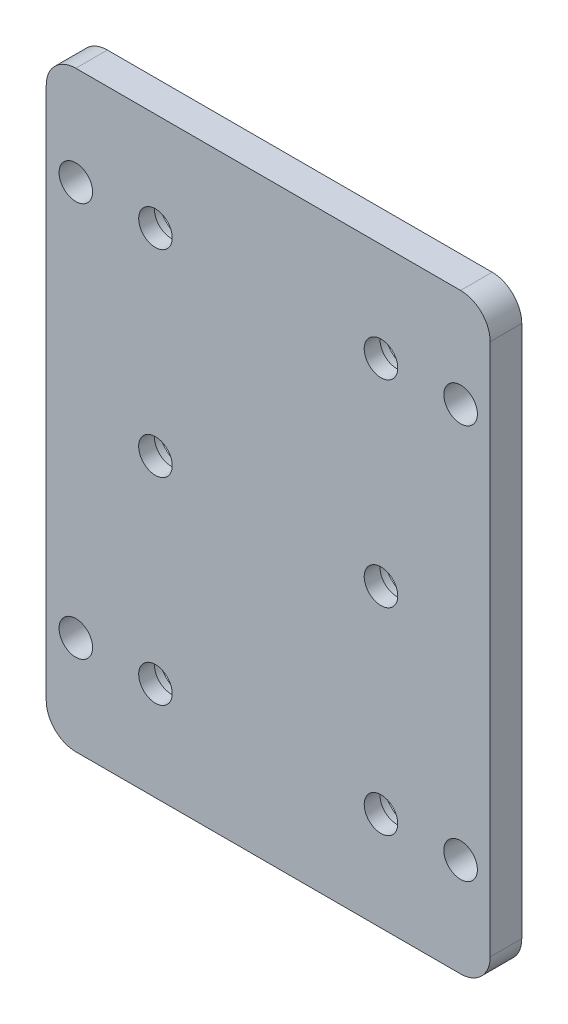
ISO-10303-21;
HEADER;
FILE_DESCRIPTION(('STEP AP214'),'2;1');
FILE_NAME('part.step','',(''),(''),'','','');
FILE_SCHEMA(('AUTOMOTIVE_DESIGN { 1 0 10303 214 1 1 1 1 }'));
ENDSEC;
DATA;
#1=APPLICATION_CONTEXT('core data for automotive mechanical design processes');
#2=APPLICATION_PROTOCOL_DEFINITION('international standard','automotive_design',2000,#1);
#3=PRODUCT_CONTEXT('',#1,'mechanical');
#4=PRODUCT('Part','Part','',(#3));
#5=PRODUCT_RELATED_PRODUCT_CATEGORY('part','',(#4));
#6=PRODUCT_DEFINITION_FORMATION('','',#4);
#7=PRODUCT_DEFINITION_CONTEXT('part definition',#1,'design');
#8=PRODUCT_DEFINITION('design','',#6,#7);
#9=PRODUCT_DEFINITION_SHAPE('','',#8);
#10=(LENGTH_UNIT() NAMED_UNIT(*) SI_UNIT(.MILLI.,.METRE.));
#11=(NAMED_UNIT(*) PLANE_ANGLE_UNIT() SI_UNIT($,.RADIAN.));
#12=(NAMED_UNIT(*) SI_UNIT($,.STERADIAN.) SOLID_ANGLE_UNIT());
#13=UNCERTAINTY_MEASURE_WITH_UNIT(LENGTH_MEASURE(1.E-05),#10,'distance_accuracy_value','');
#14=(GEOMETRIC_REPRESENTATION_CONTEXT(3) GLOBAL_UNCERTAINTY_ASSIGNED_CONTEXT((#13)) GLOBAL_UNIT_ASSIGNED_CONTEXT((#10,
#11,#12)) REPRESENTATION_CONTEXT('',''));
#15=CARTESIAN_POINT('',(0.,0.,0.));
#16=DIRECTION('',(0.,0.,1.));
#17=DIRECTION('',(1.,0.,0.));
#18=AXIS2_PLACEMENT_3D('',#15,#16,#17);
#19=CARTESIAN_POINT('',(-11.43,0.,0.));
#20=DIRECTION('',(0.,0.,1.));
#21=DIRECTION('',(1.,0.,0.));
#22=AXIS2_PLACEMENT_3D('',#19,#20,#21);
#23=CYLINDRICAL_SURFACE('',#22,1.7);
#24=CARTESIAN_POINT('',(-11.43,0.,3.2));
#25=DIRECTION('',(0.,0.,1.));
#26=DIRECTION('',(1.,0.,0.));
#27=AXIS2_PLACEMENT_3D('',#24,#25,#26);
#28=CIRCLE('',#27,1.7);
#29=CARTESIAN_POINT('',(-9.73,0.,3.2));
#30=VERTEX_POINT('',#29);
#31=EDGE_CURVE('E128',#30,#30,#28,.T.);
#32=ORIENTED_EDGE('',*,*,#31,.T.);
#33=EDGE_LOOP('',(#32));
#34=FACE_BOUND('',#33,.T.);
#35=CARTESIAN_POINT('',(-11.43,0.,1.6));
#36=DIRECTION('',(0.,0.,-1.));
#37=DIRECTION('',(-1.,0.,0.));
#38=AXIS2_PLACEMENT_3D('',#35,#36,#37);
#39=CIRCLE('',#38,1.7);
#40=CARTESIAN_POINT('',(-13.13,0.,1.6));
#41=VERTEX_POINT('',#40);
#42=EDGE_CURVE('E37',#41,#41,#39,.F.);
#43=ORIENTED_EDGE('',*,*,#42,.F.);
#44=EDGE_LOOP('',(#43));
#45=FACE_BOUND('',#44,.T.);
#46=ADVANCED_FACE('F33',(#34,#45),#23,.F.);
#47=CARTESIAN_POINT('',(11.43,0.,0.));
#48=DIRECTION('',(0.,0.,1.));
#49=DIRECTION('',(1.,0.,0.));
#50=AXIS2_PLACEMENT_3D('',#47,#48,#49);
#51=CYLINDRICAL_SURFACE('',#50,1.7);
#52=CARTESIAN_POINT('',(11.43,0.,3.2));
#53=DIRECTION('',(0.,0.,1.));
#54=DIRECTION('',(1.,0.,0.));
#55=AXIS2_PLACEMENT_3D('',#52,#53,#54);
#56=CIRCLE('',#55,1.7);
#57=CARTESIAN_POINT('',(13.13,0.,3.2));
#58=VERTEX_POINT('',#57);
#59=EDGE_CURVE('E134',#58,#58,#56,.T.);
#60=ORIENTED_EDGE('',*,*,#59,.T.);
#61=EDGE_LOOP('',(#60));
#62=FACE_BOUND('',#61,.T.);
#63=CARTESIAN_POINT('',(11.43,0.,1.6));
#64=DIRECTION('',(0.,0.,-1.));
#65=DIRECTION('',(-1.,0.,0.));
#66=AXIS2_PLACEMENT_3D('',#63,#64,#65);
#67=CIRCLE('',#66,1.7);
#68=CARTESIAN_POINT('',(9.73,0.,1.6));
#69=VERTEX_POINT('',#68);
#70=EDGE_CURVE('E178',#69,#69,#67,.F.);
#71=ORIENTED_EDGE('',*,*,#70,.F.);
#72=EDGE_LOOP('',(#71));
#73=FACE_BOUND('',#72,.T.);
#74=ADVANCED_FACE('F265',(#62,#73),#51,.F.);
#75=CARTESIAN_POINT('',(-11.4300000000001,20.,0.));
#76=DIRECTION('',(0.,0.,1.));
#77=DIRECTION('',(1.,0.,0.));
#78=AXIS2_PLACEMENT_3D('',#75,#76,#77);
#79=CYLINDRICAL_SURFACE('',#78,1.7);
#80=CARTESIAN_POINT('',(-11.4300000000001,20.,3.2));
#81=DIRECTION('',(0.,0.,1.));
#82=DIRECTION('',(1.,0.,0.));
#83=AXIS2_PLACEMENT_3D('',#80,#81,#82);
#84=CIRCLE('',#83,1.7);
#85=CARTESIAN_POINT('',(-9.73000000000007,20.,3.2));
#86=VERTEX_POINT('',#85);
#87=EDGE_CURVE('E221',#86,#86,#84,.T.);
#88=ORIENTED_EDGE('',*,*,#87,.T.);
#89=EDGE_LOOP('',(#88));
#90=FACE_BOUND('',#89,.T.);
#91=CARTESIAN_POINT('',(-11.4300000000001,20.,1.6));
#92=DIRECTION('',(0.,0.,-1.));
#93=DIRECTION('',(-1.,0.,0.));
#94=AXIS2_PLACEMENT_3D('',#91,#92,#93);
#95=CIRCLE('',#94,1.7);
#96=CARTESIAN_POINT('',(-13.1300000000001,20.,1.6));
#97=VERTEX_POINT('',#96);
#98=EDGE_CURVE('E176',#97,#97,#95,.F.);
#99=ORIENTED_EDGE('',*,*,#98,.F.);
#100=EDGE_LOOP('',(#99));
#101=FACE_BOUND('',#100,.T.);
#102=ADVANCED_FACE('F271',(#90,#101),#79,.F.);
#103=CARTESIAN_POINT('',(-11.4300000000001,-20.,0.));
#104=DIRECTION('',(0.,0.,1.));
#105=DIRECTION('',(1.,0.,0.));
#106=AXIS2_PLACEMENT_3D('',#103,#104,#105);
#107=CYLINDRICAL_SURFACE('',#106,1.7);
#108=CARTESIAN_POINT('',(-11.4300000000001,-20.,3.2));
#109=DIRECTION('',(0.,0.,1.));
#110=DIRECTION('',(-1.,0.,0.));
#111=AXIS2_PLACEMENT_3D('',#108,#109,#110);
#112=CIRCLE('',#111,1.7);
#113=CARTESIAN_POINT('',(-13.1300000000001,-20.,3.2));
#114=VERTEX_POINT('',#113);
#115=EDGE_CURVE('E222',#114,#114,#112,.T.);
#116=ORIENTED_EDGE('',*,*,#115,.T.);
#117=EDGE_LOOP('',(#116));
#118=FACE_BOUND('',#117,.T.);
#119=CARTESIAN_POINT('',(-11.4300000000001,-20.,1.6));
#120=DIRECTION('',(0.,0.,-1.));
#121=DIRECTION('',(-1.,0.,0.));
#122=AXIS2_PLACEMENT_3D('',#119,#120,#121);
#123=CIRCLE('',#122,1.7);
#124=CARTESIAN_POINT('',(-13.1300000000001,-20.,1.6));
#125=VERTEX_POINT('',#124);
#126=EDGE_CURVE('E172',#125,#125,#123,.F.);
#127=ORIENTED_EDGE('',*,*,#126,.F.);
#128=EDGE_LOOP('',(#127));
#129=FACE_BOUND('',#128,.T.);
#130=ADVANCED_FACE('F331',(#118,#129),#107,.F.);
#131=CARTESIAN_POINT('',(11.4299999999999,-20.,0.));
#132=DIRECTION('',(0.,0.,1.));
#133=DIRECTION('',(1.,0.,0.));
#134=AXIS2_PLACEMENT_3D('',#131,#132,#133);
#135=CYLINDRICAL_SURFACE('',#134,1.7);
#136=CARTESIAN_POINT('',(11.4299999999999,-20.,3.2));
#137=DIRECTION('',(0.,0.,1.));
#138=DIRECTION('',(-1.,0.,0.));
#139=AXIS2_PLACEMENT_3D('',#136,#137,#138);
#140=CIRCLE('',#139,1.7);
#141=CARTESIAN_POINT('',(9.7299999999999,-20.,3.2));
#142=VERTEX_POINT('',#141);
#143=EDGE_CURVE('E215',#142,#142,#140,.T.);
#144=ORIENTED_EDGE('',*,*,#143,.T.);
#145=EDGE_LOOP('',(#144));
#146=FACE_BOUND('',#145,.T.);
#147=CARTESIAN_POINT('',(11.4299999999999,-20.,1.6));
#148=DIRECTION('',(0.,0.,-1.));
#149=DIRECTION('',(-1.,0.,0.));
#150=AXIS2_PLACEMENT_3D('',#147,#148,#149);
#151=CIRCLE('',#150,1.7);
#152=CARTESIAN_POINT('',(9.7299999999999,-20.,1.6));
#153=VERTEX_POINT('',#152);
#154=EDGE_CURVE('E169',#153,#153,#151,.F.);
#155=ORIENTED_EDGE('',*,*,#154,.F.);
#156=EDGE_LOOP('',(#155));
#157=FACE_BOUND('',#156,.T.);
#158=ADVANCED_FACE('F340',(#146,#157),#135,.F.);
#159=CARTESIAN_POINT('',(11.4299999999999,20.,0.));
#160=DIRECTION('',(0.,0.,1.));
#161=DIRECTION('',(1.,0.,0.));
#162=AXIS2_PLACEMENT_3D('',#159,#160,#161);
#163=CYLINDRICAL_SURFACE('',#162,1.7);
#164=CARTESIAN_POINT('',(11.4299999999999,20.,3.2));
#165=DIRECTION('',(0.,0.,1.));
#166=DIRECTION('',(1.,0.,0.));
#167=AXIS2_PLACEMENT_3D('',#164,#165,#166);
#168=CIRCLE('',#167,1.7);
#169=CARTESIAN_POINT('',(13.1299999999999,20.,3.2));
#170=VERTEX_POINT('',#169);
#171=EDGE_CURVE('E218',#170,#170,#168,.T.);
#172=ORIENTED_EDGE('',*,*,#171,.T.);
#173=EDGE_LOOP('',(#172));
#174=FACE_BOUND('',#173,.T.);
#175=CARTESIAN_POINT('',(11.4299999999999,20.,1.6));
#176=DIRECTION('',(0.,0.,-1.));
#177=DIRECTION('',(-1.,0.,0.));
#178=AXIS2_PLACEMENT_3D('',#175,#176,#177);
#179=CIRCLE('',#178,1.7);
#180=CARTESIAN_POINT('',(9.72999999999993,20.,1.6));
#181=VERTEX_POINT('',#180);
#182=EDGE_CURVE('E164',#181,#181,#179,.F.);
#183=ORIENTED_EDGE('',*,*,#182,.F.);
#184=EDGE_LOOP('',(#183));
#185=FACE_BOUND('',#184,.T.);
#186=ADVANCED_FACE('F292',(#174,#185),#163,.F.);
#187=CARTESIAN_POINT('',(-22.5,30.,3.2));
#188=DIRECTION('',(1.,0.,0.));
#189=DIRECTION('',(0.,0.,-1.));
#190=AXIS2_PLACEMENT_3D('',#187,#188,#189);
#191=PLANE('',#190);
#192=DIRECTION('',(0.,-1.,0.));
#193=VECTOR('',#192,1.);
#194=CARTESIAN_POINT('',(-22.5,30.,3.2));
#195=LINE('',#194,#193);
#196=CARTESIAN_POINT('',(-22.5,27.,3.2));
#197=VERTEX_POINT('',#196);
#198=CARTESIAN_POINT('',(-22.5,-27.,3.2));
#199=VERTEX_POINT('',#198);
#200=EDGE_CURVE('E121',#197,#199,#195,.T.);
#201=ORIENTED_EDGE('',*,*,#200,.F.);
#202=DIRECTION('',(0.,0.,-1.));
#203=VECTOR('',#202,1.);
#204=CARTESIAN_POINT('',(-22.5,27.,3.2));
#205=LINE('',#204,#203);
#206=CARTESIAN_POINT('',(-22.5,27.,0.));
#207=VERTEX_POINT('',#206);
#208=EDGE_CURVE('E105',#197,#207,#205,.T.);
#209=ORIENTED_EDGE('',*,*,#208,.T.);
#210=DIRECTION('',(0.,-1.,0.));
#211=VECTOR('',#210,1.);
#212=CARTESIAN_POINT('',(-22.5,30.,0.));
#213=LINE('',#212,#211);
#214=CARTESIAN_POINT('',(-22.5,-27.,0.));
#215=VERTEX_POINT('',#214);
#216=EDGE_CURVE('E118',#207,#215,#213,.T.);
#217=ORIENTED_EDGE('',*,*,#216,.T.);
#218=DIRECTION('',(0.,0.,-1.));
#219=VECTOR('',#218,1.);
#220=CARTESIAN_POINT('',(-22.5,-27.,3.2));
#221=LINE('',#220,#219);
#222=EDGE_CURVE('E123',#215,#199,#221,.F.);
#223=ORIENTED_EDGE('',*,*,#222,.T.);
#224=EDGE_LOOP('',(#201,#209,#217,#223));
#225=FACE_BOUND('',#224,.T.);
#226=ADVANCED_FACE('F117',(#225),#191,.F.);
#227=CARTESIAN_POINT('',(-22.5,-30.,3.2));
#228=DIRECTION('',(0.,1.,0.));
#229=DIRECTION('',(0.,0.,1.));
#230=AXIS2_PLACEMENT_3D('',#227,#228,#229);
#231=PLANE('',#230);
#232=DIRECTION('',(1.,0.,0.));
#233=VECTOR('',#232,1.);
#234=CARTESIAN_POINT('',(-22.5,-30.,0.));
#235=LINE('',#234,#233);
#236=CARTESIAN_POINT('',(-19.5,-30.,0.));
#237=VERTEX_POINT('',#236);
#238=CARTESIAN_POINT('',(19.5,-30.,0.));
#239=VERTEX_POINT('',#238);
#240=EDGE_CURVE('E127',#237,#239,#235,.T.);
#241=ORIENTED_EDGE('',*,*,#240,.T.);
#242=DIRECTION('',(0.,0.,-1.));
#243=VECTOR('',#242,1.);
#244=CARTESIAN_POINT('',(19.5,-30.,3.2));
#245=LINE('',#244,#243);
#246=CARTESIAN_POINT('',(19.5,-30.,3.2));
#247=VERTEX_POINT('',#246);
#248=EDGE_CURVE('E11',#239,#247,#245,.F.);
#249=ORIENTED_EDGE('',*,*,#248,.T.);
#250=DIRECTION('',(1.,0.,0.));
#251=VECTOR('',#250,1.);
#252=CARTESIAN_POINT('',(-22.5,-30.,3.2));
#253=LINE('',#252,#251);
#254=CARTESIAN_POINT('',(-19.5,-30.,3.2));
#255=VERTEX_POINT('',#254);
#256=EDGE_CURVE('E232',#255,#247,#253,.T.);
#257=ORIENTED_EDGE('',*,*,#256,.F.);
#258=DIRECTION('',(0.,0.,-1.));
#259=VECTOR('',#258,1.);
#260=CARTESIAN_POINT('',(-19.5,-30.,3.2));
#261=LINE('',#260,#259);
#262=EDGE_CURVE('E42',#255,#237,#261,.T.);
#263=ORIENTED_EDGE('',*,*,#262,.T.);
#264=EDGE_LOOP('',(#241,#249,#257,#263));
#265=FACE_BOUND('',#264,.T.);
#266=ADVANCED_FACE('F250',(#265),#231,.F.);
#267=CARTESIAN_POINT('',(22.5,30.,3.2));
#268=DIRECTION('',(-1.,0.,0.));
#269=DIRECTION('',(0.,-1.,0.));
#270=AXIS2_PLACEMENT_3D('',#267,#268,#269);
#271=PLANE('',#270);
#272=DIRECTION('',(0.,1.,0.));
#273=VECTOR('',#272,1.);
#274=CARTESIAN_POINT('',(22.5,30.,0.));
#275=LINE('',#274,#273);
#276=CARTESIAN_POINT('',(22.5,-27.,0.));
#277=VERTEX_POINT('',#276);
#278=CARTESIAN_POINT('',(22.5,27.,0.));
#279=VERTEX_POINT('',#278);
#280=EDGE_CURVE('E131',#277,#279,#275,.T.);
#281=ORIENTED_EDGE('',*,*,#280,.T.);
#282=DIRECTION('',(0.,0.,-1.));
#283=VECTOR('',#282,1.);
#284=CARTESIAN_POINT('',(22.5,27.,3.2));
#285=LINE('',#284,#283);
#286=CARTESIAN_POINT('',(22.5,27.,3.2));
#287=VERTEX_POINT('',#286);
#288=EDGE_CURVE('E50',#279,#287,#285,.F.);
#289=ORIENTED_EDGE('',*,*,#288,.T.);
#290=DIRECTION('',(0.,1.,0.));
#291=VECTOR('',#290,1.);
#292=CARTESIAN_POINT('',(22.5,30.,3.2));
#293=LINE('',#292,#291);
#294=CARTESIAN_POINT('',(22.5,-27.,3.2));
#295=VERTEX_POINT('',#294);
#296=EDGE_CURVE('E233',#295,#287,#293,.T.);
#297=ORIENTED_EDGE('',*,*,#296,.F.);
#298=DIRECTION('',(0.,0.,-1.));
#299=VECTOR('',#298,1.);
#300=CARTESIAN_POINT('',(22.5,-27.,3.2));
#301=LINE('',#300,#299);
#302=EDGE_CURVE('E158',#295,#277,#301,.T.);
#303=ORIENTED_EDGE('',*,*,#302,.T.);
#304=EDGE_LOOP('',(#281,#289,#297,#303));
#305=FACE_BOUND('',#304,.T.);
#306=ADVANCED_FACE('F244',(#305),#271,.F.);
#307=CARTESIAN_POINT('',(-22.5,30.,3.2));
#308=DIRECTION('',(0.,-1.,0.));
#309=DIRECTION('',(0.,0.,-1.));
#310=AXIS2_PLACEMENT_3D('',#307,#308,#309);
#311=PLANE('',#310);
#312=DIRECTION('',(-1.,0.,0.));
#313=VECTOR('',#312,1.);
#314=CARTESIAN_POINT('',(-22.5,30.,0.));
#315=LINE('',#314,#313);
#316=CARTESIAN_POINT('',(19.5,30.,0.));
#317=VERTEX_POINT('',#316);
#318=CARTESIAN_POINT('',(-19.5,30.,0.));
#319=VERTEX_POINT('',#318);
#320=EDGE_CURVE('E141',#317,#319,#315,.T.);
#321=ORIENTED_EDGE('',*,*,#320,.T.);
#322=DIRECTION('',(0.,0.,-1.));
#323=VECTOR('',#322,1.);
#324=CARTESIAN_POINT('',(-19.5,30.,3.2));
#325=LINE('',#324,#323);
#326=CARTESIAN_POINT('',(-19.5,30.,3.2));
#327=VERTEX_POINT('',#326);
#328=EDGE_CURVE('E106',#319,#327,#325,.F.);
#329=ORIENTED_EDGE('',*,*,#328,.T.);
#330=DIRECTION('',(-1.,0.,0.));
#331=VECTOR('',#330,1.);
#332=CARTESIAN_POINT('',(-22.5,30.,3.2));
#333=LINE('',#332,#331);
#334=CARTESIAN_POINT('',(19.5,30.,3.2));
#335=VERTEX_POINT('',#334);
#336=EDGE_CURVE('E137',#335,#327,#333,.T.);
#337=ORIENTED_EDGE('',*,*,#336,.F.);
#338=DIRECTION('',(0.,0.,-1.));
#339=VECTOR('',#338,1.);
#340=CARTESIAN_POINT('',(19.5,30.,3.2));
#341=LINE('',#340,#339);
#342=EDGE_CURVE('E111',#335,#317,#341,.T.);
#343=ORIENTED_EDGE('',*,*,#342,.T.);
#344=EDGE_LOOP('',(#321,#329,#337,#343));
#345=FACE_BOUND('',#344,.T.);
#346=ADVANCED_FACE('F240',(#345),#311,.F.);
#347=CARTESIAN_POINT('',(0.,0.,3.2));
#348=DIRECTION('',(0.,0.,1.));
#349=DIRECTION('',(1.,0.,0.));
#350=AXIS2_PLACEMENT_3D('',#347,#348,#349);
#351=PLANE('',#350);
#352=CARTESIAN_POINT('',(19.5,20.,3.2));
#353=DIRECTION('',(0.,0.,1.));
#354=DIRECTION('',(1.,0.,0.));
#355=AXIS2_PLACEMENT_3D('',#352,#353,#354);
#356=CIRCLE('',#355,1.7);
#357=CARTESIAN_POINT('',(21.2,20.,3.2));
#358=VERTEX_POINT('',#357);
#359=EDGE_CURVE('E198',#358,#358,#356,.T.);
#360=ORIENTED_EDGE('',*,*,#359,.F.);
#361=EDGE_LOOP('',(#360));
#362=FACE_BOUND('',#361,.T.);
#363=CARTESIAN_POINT('',(19.5,-20.,3.2));
#364=DIRECTION('',(0.,0.,1.));
#365=DIRECTION('',(-1.,0.,0.));
#366=AXIS2_PLACEMENT_3D('',#363,#364,#365);
#367=CIRCLE('',#366,1.7);
#368=CARTESIAN_POINT('',(17.8,-20.,3.2));
#369=VERTEX_POINT('',#368);
#370=EDGE_CURVE('E204',#369,#369,#367,.T.);
#371=ORIENTED_EDGE('',*,*,#370,.F.);
#372=EDGE_LOOP('',(#371));
#373=FACE_BOUND('',#372,.T.);
#374=CARTESIAN_POINT('',(-19.5,-20.,3.2));
#375=DIRECTION('',(0.,0.,1.));
#376=DIRECTION('',(-1.,0.,0.));
#377=AXIS2_PLACEMENT_3D('',#374,#375,#376);
#378=CIRCLE('',#377,1.7);
#379=CARTESIAN_POINT('',(-21.2,-20.,3.2));
#380=VERTEX_POINT('',#379);
#381=EDGE_CURVE('E167',#380,#380,#378,.T.);
#382=ORIENTED_EDGE('',*,*,#381,.F.);
#383=EDGE_LOOP('',(#382));
#384=FACE_BOUND('',#383,.T.);
#385=CARTESIAN_POINT('',(-19.5,20.,3.2));
#386=DIRECTION('',(0.,0.,1.));
#387=DIRECTION('',(1.,0.,0.));
#388=AXIS2_PLACEMENT_3D('',#385,#386,#387);
#389=CIRCLE('',#388,1.7);
#390=CARTESIAN_POINT('',(-17.8,20.,3.2));
#391=VERTEX_POINT('',#390);
#392=EDGE_CURVE('E197',#391,#391,#389,.T.);
#393=ORIENTED_EDGE('',*,*,#392,.F.);
#394=EDGE_LOOP('',(#393));
#395=FACE_BOUND('',#394,.T.);
#396=ORIENTED_EDGE('',*,*,#143,.F.);
#397=EDGE_LOOP('',(#396));
#398=FACE_BOUND('',#397,.T.);
#399=ORIENTED_EDGE('',*,*,#115,.F.);
#400=EDGE_LOOP('',(#399));
#401=FACE_BOUND('',#400,.T.);
#402=ORIENTED_EDGE('',*,*,#171,.F.);
#403=EDGE_LOOP('',(#402));
#404=FACE_BOUND('',#403,.T.);
#405=ORIENTED_EDGE('',*,*,#87,.F.);
#406=EDGE_LOOP('',(#405));
#407=FACE_BOUND('',#406,.T.);
#408=ORIENTED_EDGE('',*,*,#59,.F.);
#409=EDGE_LOOP('',(#408));
#410=FACE_BOUND('',#409,.T.);
#411=ORIENTED_EDGE('',*,*,#31,.F.);
#412=EDGE_LOOP('',(#411));
#413=FACE_BOUND('',#412,.T.);
#414=ORIENTED_EDGE('',*,*,#336,.T.);
#415=CARTESIAN_POINT('',(-19.5,27.,3.2));
#416=DIRECTION('',(0.,0.,1.));
#417=DIRECTION('',(1.,0.,0.));
#418=AXIS2_PLACEMENT_3D('',#415,#416,#417);
#419=CIRCLE('',#418,3.);
#420=EDGE_CURVE('E156',#327,#197,#419,.T.);
#421=ORIENTED_EDGE('',*,*,#420,.T.);
#422=ORIENTED_EDGE('',*,*,#200,.T.);
#423=CARTESIAN_POINT('',(-19.5,-27.,3.2));
#424=DIRECTION('',(0.,0.,1.));
#425=DIRECTION('',(1.,0.,0.));
#426=AXIS2_PLACEMENT_3D('',#423,#424,#425);
#427=CIRCLE('',#426,3.);
#428=EDGE_CURVE('E151',#199,#255,#427,.T.);
#429=ORIENTED_EDGE('',*,*,#428,.T.);
#430=ORIENTED_EDGE('',*,*,#256,.T.);
#431=CARTESIAN_POINT('',(19.5,-27.,3.2));
#432=DIRECTION('',(0.,0.,1.));
#433=DIRECTION('',(1.,0.,0.));
#434=AXIS2_PLACEMENT_3D('',#431,#432,#433);
#435=CIRCLE('',#434,3.);
#436=EDGE_CURVE('E57',#247,#295,#435,.T.);
#437=ORIENTED_EDGE('',*,*,#436,.T.);
#438=ORIENTED_EDGE('',*,*,#296,.T.);
#439=CARTESIAN_POINT('',(19.5,27.,3.2));
#440=DIRECTION('',(0.,0.,1.));
#441=DIRECTION('',(1.,0.,0.));
#442=AXIS2_PLACEMENT_3D('',#439,#440,#441);
#443=CIRCLE('',#442,3.);
#444=EDGE_CURVE('E154',#287,#335,#443,.T.);
#445=ORIENTED_EDGE('',*,*,#444,.T.);
#446=EDGE_LOOP('',(#414,#421,#422,#429,#430,#437,#438,#445));
#447=FACE_BOUND('',#446,.T.);
#448=ADVANCED_FACE('F237',(#362,#373,#384,#395,#398,#401,#404,#407,#410,#413,#447),#351,.T.);
#449=CARTESIAN_POINT('',(0.,0.,0.));
#450=DIRECTION('',(0.,0.,1.));
#451=DIRECTION('',(1.,0.,0.));
#452=AXIS2_PLACEMENT_3D('',#449,#450,#451);
#453=PLANE('',#452);
#454=CARTESIAN_POINT('',(-11.4300000000001,-20.,0.));
#455=DIRECTION('',(0.,0.,-1.));
#456=DIRECTION('',(-1.,0.,0.));
#457=AXIS2_PLACEMENT_3D('',#454,#455,#456);
#458=CIRCLE('',#457,3.);
#459=CARTESIAN_POINT('',(-14.4300000000001,-20.,0.));
#460=VERTEX_POINT('',#459);
#461=EDGE_CURVE('E620',#460,#460,#458,.T.);
#462=ORIENTED_EDGE('',*,*,#461,.F.);
#463=EDGE_LOOP('',(#462));
#464=FACE_BOUND('',#463,.T.);
#465=CARTESIAN_POINT('',(11.4299999999999,-20.,0.));
#466=DIRECTION('',(0.,0.,-1.));
#467=DIRECTION('',(-1.,0.,0.));
#468=AXIS2_PLACEMENT_3D('',#465,#466,#467);
#469=CIRCLE('',#468,3.);
#470=CARTESIAN_POINT('',(8.4299999999999,-20.,0.));
#471=VERTEX_POINT('',#470);
#472=EDGE_CURVE('E612',#471,#471,#469,.T.);
#473=ORIENTED_EDGE('',*,*,#472,.F.);
#474=EDGE_LOOP('',(#473));
#475=FACE_BOUND('',#474,.T.);
#476=CARTESIAN_POINT('',(-11.43,0.,0.));
#477=DIRECTION('',(0.,0.,-1.));
#478=DIRECTION('',(-1.,0.,0.));
#479=AXIS2_PLACEMENT_3D('',#476,#477,#478);
#480=CIRCLE('',#479,3.);
#481=CARTESIAN_POINT('',(-14.43,0.,0.));
#482=VERTEX_POINT('',#481);
#483=EDGE_CURVE('E605',#482,#482,#480,.T.);
#484=ORIENTED_EDGE('',*,*,#483,.F.);
#485=EDGE_LOOP('',(#484));
#486=FACE_BOUND('',#485,.T.);
#487=CARTESIAN_POINT('',(11.43,0.,0.));
#488=DIRECTION('',(0.,0.,-1.));
#489=DIRECTION('',(-1.,0.,0.));
#490=AXIS2_PLACEMENT_3D('',#487,#488,#489);
#491=CIRCLE('',#490,3.);
#492=CARTESIAN_POINT('',(8.43,0.,0.));
#493=VERTEX_POINT('',#492);
#494=EDGE_CURVE('E609',#493,#493,#491,.T.);
#495=ORIENTED_EDGE('',*,*,#494,.F.);
#496=EDGE_LOOP('',(#495));
#497=FACE_BOUND('',#496,.T.);
#498=CARTESIAN_POINT('',(-11.4300000000001,20.,0.));
#499=DIRECTION('',(0.,0.,-1.));
#500=DIRECTION('',(-1.,0.,0.));
#501=AXIS2_PLACEMENT_3D('',#498,#499,#500);
#502=CIRCLE('',#501,3.);
#503=CARTESIAN_POINT('',(-14.4300000000001,20.,0.));
#504=VERTEX_POINT('',#503);
#505=EDGE_CURVE('E625',#504,#504,#502,.T.);
#506=ORIENTED_EDGE('',*,*,#505,.F.);
#507=EDGE_LOOP('',(#506));
#508=FACE_BOUND('',#507,.T.);
#509=CARTESIAN_POINT('',(11.4299999999999,20.,0.));
#510=DIRECTION('',(0.,0.,-1.));
#511=DIRECTION('',(-1.,0.,0.));
#512=AXIS2_PLACEMENT_3D('',#509,#510,#511);
#513=CIRCLE('',#512,3.);
#514=CARTESIAN_POINT('',(8.42999999999993,20.,0.));
#515=VERTEX_POINT('',#514);
#516=EDGE_CURVE('E183',#515,#515,#513,.T.);
#517=ORIENTED_EDGE('',*,*,#516,.F.);
#518=EDGE_LOOP('',(#517));
#519=FACE_BOUND('',#518,.T.);
#520=CARTESIAN_POINT('',(19.5,20.,0.));
#521=DIRECTION('',(0.,0.,1.));
#522=DIRECTION('',(1.,0.,0.));
#523=AXIS2_PLACEMENT_3D('',#520,#521,#522);
#524=CIRCLE('',#523,1.7);
#525=CARTESIAN_POINT('',(21.2,20.,0.));
#526=VERTEX_POINT('',#525);
#527=EDGE_CURVE('E194',#526,#526,#524,.T.);
#528=ORIENTED_EDGE('',*,*,#527,.T.);
#529=EDGE_LOOP('',(#528));
#530=FACE_BOUND('',#529,.T.);
#531=CARTESIAN_POINT('',(19.5,-20.,0.));
#532=DIRECTION('',(0.,0.,1.));
#533=DIRECTION('',(-1.,0.,0.));
#534=AXIS2_PLACEMENT_3D('',#531,#532,#533);
#535=CIRCLE('',#534,1.7);
#536=CARTESIAN_POINT('',(17.8,-20.,0.));
#537=VERTEX_POINT('',#536);
#538=EDGE_CURVE('E201',#537,#537,#535,.T.);
#539=ORIENTED_EDGE('',*,*,#538,.T.);
#540=EDGE_LOOP('',(#539));
#541=FACE_BOUND('',#540,.T.);
#542=CARTESIAN_POINT('',(-19.5,-20.,0.));
#543=DIRECTION('',(0.,0.,1.));
#544=DIRECTION('',(-1.,0.,0.));
#545=AXIS2_PLACEMENT_3D('',#542,#543,#544);
#546=CIRCLE('',#545,1.7);
#547=CARTESIAN_POINT('',(-21.2,-20.,0.));
#548=VERTEX_POINT('',#547);
#549=EDGE_CURVE('E207',#548,#548,#546,.T.);
#550=ORIENTED_EDGE('',*,*,#549,.T.);
#551=EDGE_LOOP('',(#550));
#552=FACE_BOUND('',#551,.T.);
#553=CARTESIAN_POINT('',(-19.5,20.,0.));
#554=DIRECTION('',(0.,0.,1.));
#555=DIRECTION('',(1.,0.,0.));
#556=AXIS2_PLACEMENT_3D('',#553,#554,#555);
#557=CIRCLE('',#556,1.7);
#558=CARTESIAN_POINT('',(-17.8,20.,0.));
#559=VERTEX_POINT('',#558);
#560=EDGE_CURVE('E212',#559,#559,#557,.T.);
#561=ORIENTED_EDGE('',*,*,#560,.T.);
#562=EDGE_LOOP('',(#561));
#563=FACE_BOUND('',#562,.T.);
#564=ORIENTED_EDGE('',*,*,#216,.F.);
#565=CARTESIAN_POINT('',(-19.5,27.,0.));
#566=DIRECTION('',(0.,0.,1.));
#567=DIRECTION('',(1.,0.,0.));
#568=AXIS2_PLACEMENT_3D('',#565,#566,#567);
#569=CIRCLE('',#568,3.);
#570=EDGE_CURVE('E101',#207,#319,#569,.F.);
#571=ORIENTED_EDGE('',*,*,#570,.T.);
#572=ORIENTED_EDGE('',*,*,#320,.F.);
#573=CARTESIAN_POINT('',(19.5,27.,0.));
#574=DIRECTION('',(0.,0.,1.));
#575=DIRECTION('',(1.,0.,0.));
#576=AXIS2_PLACEMENT_3D('',#573,#574,#575);
#577=CIRCLE('',#576,3.);
#578=EDGE_CURVE('E112',#317,#279,#577,.F.);
#579=ORIENTED_EDGE('',*,*,#578,.T.);
#580=ORIENTED_EDGE('',*,*,#280,.F.);
#581=CARTESIAN_POINT('',(19.5,-27.,0.));
#582=DIRECTION('',(0.,0.,1.));
#583=DIRECTION('',(1.,0.,0.));
#584=AXIS2_PLACEMENT_3D('',#581,#582,#583);
#585=CIRCLE('',#584,3.);
#586=EDGE_CURVE('E145',#277,#239,#585,.F.);
#587=ORIENTED_EDGE('',*,*,#586,.T.);
#588=ORIENTED_EDGE('',*,*,#240,.F.);
#589=CARTESIAN_POINT('',(-19.5,-27.,0.));
#590=DIRECTION('',(0.,0.,1.));
#591=DIRECTION('',(1.,0.,0.));
#592=AXIS2_PLACEMENT_3D('',#589,#590,#591);
#593=CIRCLE('',#592,3.);
#594=EDGE_CURVE('E122',#237,#215,#593,.F.);
#595=ORIENTED_EDGE('',*,*,#594,.T.);
#596=EDGE_LOOP('',(#564,#571,#572,#579,#580,#587,#588,#595));
#597=FACE_BOUND('',#596,.T.);
#598=ADVANCED_FACE('F125',(#464,#475,#486,#497,#508,#519,#530,#541,#552,#563,#597),#453,.F.);
#599=CARTESIAN_POINT('',(-19.5,20.,0.));
#600=DIRECTION('',(0.,0.,1.));
#601=DIRECTION('',(1.,0.,0.));
#602=AXIS2_PLACEMENT_3D('',#599,#600,#601);
#603=CYLINDRICAL_SURFACE('',#602,1.7);
#604=ORIENTED_EDGE('',*,*,#560,.F.);
#605=EDGE_LOOP('',(#604));
#606=FACE_BOUND('',#605,.T.);
#607=ORIENTED_EDGE('',*,*,#392,.T.);
#608=EDGE_LOOP('',(#607));
#609=FACE_BOUND('',#608,.T.);
#610=ADVANCED_FACE('F282',(#606,#609),#603,.F.);
#611=CARTESIAN_POINT('',(-19.5,-20.,0.));
#612=DIRECTION('',(0.,0.,1.));
#613=DIRECTION('',(1.,0.,0.));
#614=AXIS2_PLACEMENT_3D('',#611,#612,#613);
#615=CYLINDRICAL_SURFACE('',#614,1.7);
#616=ORIENTED_EDGE('',*,*,#549,.F.);
#617=EDGE_LOOP('',(#616));
#618=FACE_BOUND('',#617,.T.);
#619=ORIENTED_EDGE('',*,*,#381,.T.);
#620=EDGE_LOOP('',(#619));
#621=FACE_BOUND('',#620,.T.);
#622=ADVANCED_FACE('F493',(#618,#621),#615,.F.);
#623=CARTESIAN_POINT('',(19.5,-20.,0.));
#624=DIRECTION('',(0.,0.,1.));
#625=DIRECTION('',(1.,0.,0.));
#626=AXIS2_PLACEMENT_3D('',#623,#624,#625);
#627=CYLINDRICAL_SURFACE('',#626,1.7);
#628=ORIENTED_EDGE('',*,*,#538,.F.);
#629=EDGE_LOOP('',(#628));
#630=FACE_BOUND('',#629,.T.);
#631=ORIENTED_EDGE('',*,*,#370,.T.);
#632=EDGE_LOOP('',(#631));
#633=FACE_BOUND('',#632,.T.);
#634=ADVANCED_FACE('F489',(#630,#633),#627,.F.);
#635=CARTESIAN_POINT('',(19.5,20.,0.));
#636=DIRECTION('',(0.,0.,1.));
#637=DIRECTION('',(1.,0.,0.));
#638=AXIS2_PLACEMENT_3D('',#635,#636,#637);
#639=CYLINDRICAL_SURFACE('',#638,1.7);
#640=ORIENTED_EDGE('',*,*,#527,.F.);
#641=EDGE_LOOP('',(#640));
#642=FACE_BOUND('',#641,.T.);
#643=ORIENTED_EDGE('',*,*,#359,.T.);
#644=EDGE_LOOP('',(#643));
#645=FACE_BOUND('',#644,.T.);
#646=ADVANCED_FACE('F295',(#642,#645),#639,.F.);
#647=CARTESIAN_POINT('',(-19.5,27.,3.2));
#648=DIRECTION('',(0.,0.,-1.));
#649=DIRECTION('',(-1.,0.,0.));
#650=AXIS2_PLACEMENT_3D('',#647,#648,#649);
#651=CYLINDRICAL_SURFACE('',#650,3.);
#652=ORIENTED_EDGE('',*,*,#420,.F.);
#653=ORIENTED_EDGE('',*,*,#328,.F.);
#654=ORIENTED_EDGE('',*,*,#570,.F.);
#655=ORIENTED_EDGE('',*,*,#208,.F.);
#656=EDGE_LOOP('',(#652,#653,#654,#655));
#657=FACE_BOUND('',#656,.T.);
#658=ADVANCED_FACE('F104',(#657),#651,.T.);
#659=CARTESIAN_POINT('',(19.5,27.,3.2));
#660=DIRECTION('',(0.,0.,-1.));
#661=DIRECTION('',(-1.,0.,0.));
#662=AXIS2_PLACEMENT_3D('',#659,#660,#661);
#663=CYLINDRICAL_SURFACE('',#662,3.);
#664=ORIENTED_EDGE('',*,*,#444,.F.);
#665=ORIENTED_EDGE('',*,*,#288,.F.);
#666=ORIENTED_EDGE('',*,*,#578,.F.);
#667=ORIENTED_EDGE('',*,*,#342,.F.);
#668=EDGE_LOOP('',(#664,#665,#666,#667));
#669=FACE_BOUND('',#668,.T.);
#670=ADVANCED_FACE('F242',(#669),#663,.T.);
#671=CARTESIAN_POINT('',(19.5,-27.,3.2));
#672=DIRECTION('',(0.,0.,-1.));
#673=DIRECTION('',(-1.,0.,0.));
#674=AXIS2_PLACEMENT_3D('',#671,#672,#673);
#675=CYLINDRICAL_SURFACE('',#674,3.);
#676=ORIENTED_EDGE('',*,*,#436,.F.);
#677=ORIENTED_EDGE('',*,*,#248,.F.);
#678=ORIENTED_EDGE('',*,*,#586,.F.);
#679=ORIENTED_EDGE('',*,*,#302,.F.);
#680=EDGE_LOOP('',(#676,#677,#678,#679));
#681=FACE_BOUND('',#680,.T.);
#682=ADVANCED_FACE('F247',(#681),#675,.T.);
#683=CARTESIAN_POINT('',(-19.5,-27.,3.2));
#684=DIRECTION('',(0.,0.,-1.));
#685=DIRECTION('',(-1.,0.,0.));
#686=AXIS2_PLACEMENT_3D('',#683,#684,#685);
#687=CYLINDRICAL_SURFACE('',#686,3.);
#688=ORIENTED_EDGE('',*,*,#428,.F.);
#689=ORIENTED_EDGE('',*,*,#222,.F.);
#690=ORIENTED_EDGE('',*,*,#594,.F.);
#691=ORIENTED_EDGE('',*,*,#262,.F.);
#692=EDGE_LOOP('',(#688,#689,#690,#691));
#693=FACE_BOUND('',#692,.T.);
#694=ADVANCED_FACE('F35',(#693),#687,.T.);
#695=CARTESIAN_POINT('',(11.4299999999999,20.,1.6));
#696=DIRECTION('',(0.,0.,-1.));
#697=DIRECTION('',(-1.,0.,0.));
#698=AXIS2_PLACEMENT_3D('',#695,#696,#697);
#699=PLANE('',#698);
#700=CARTESIAN_POINT('',(11.4299999999999,20.,1.6));
#701=DIRECTION('',(0.,0.,-1.));
#702=DIRECTION('',(-1.,0.,0.));
#703=AXIS2_PLACEMENT_3D('',#700,#701,#702);
#704=CIRCLE('',#703,3.);
#705=CARTESIAN_POINT('',(8.42999999999993,20.,1.6));
#706=VERTEX_POINT('',#705);
#707=EDGE_CURVE('E168',#706,#706,#704,.T.);
#708=ORIENTED_EDGE('',*,*,#707,.T.);
#709=EDGE_LOOP('',(#708));
#710=FACE_BOUND('',#709,.T.);
#711=ORIENTED_EDGE('',*,*,#182,.T.);
#712=EDGE_LOOP('',(#711));
#713=FACE_BOUND('',#712,.T.);
#714=ADVANCED_FACE('F256',(#710,#713),#699,.T.);
#715=CARTESIAN_POINT('',(11.4299999999999,20.,1.6));
#716=DIRECTION('',(0.,0.,-1.));
#717=DIRECTION('',(-1.,0.,0.));
#718=AXIS2_PLACEMENT_3D('',#715,#716,#717);
#719=CYLINDRICAL_SURFACE('',#718,3.);
#720=ORIENTED_EDGE('',*,*,#707,.F.);
#721=EDGE_LOOP('',(#720));
#722=FACE_BOUND('',#721,.T.);
#723=ORIENTED_EDGE('',*,*,#516,.T.);
#724=EDGE_LOOP('',(#723));
#725=FACE_BOUND('',#724,.T.);
#726=ADVANCED_FACE('F261',(#722,#725),#719,.F.);
#727=CARTESIAN_POINT('',(11.4299999999999,-20.,1.6));
#728=DIRECTION('',(0.,0.,-1.));
#729=DIRECTION('',(-1.,0.,0.));
#730=AXIS2_PLACEMENT_3D('',#727,#728,#729);
#731=PLANE('',#730);
#732=CARTESIAN_POINT('',(11.4299999999999,-20.,1.6));
#733=DIRECTION('',(0.,0.,-1.));
#734=DIRECTION('',(-1.,0.,0.));
#735=AXIS2_PLACEMENT_3D('',#732,#733,#734);
#736=CIRCLE('',#735,3.);
#737=CARTESIAN_POINT('',(8.4299999999999,-20.,1.6));
#738=VERTEX_POINT('',#737);
#739=EDGE_CURVE('E607',#738,#738,#736,.T.);
#740=ORIENTED_EDGE('',*,*,#739,.T.);
#741=EDGE_LOOP('',(#740));
#742=FACE_BOUND('',#741,.T.);
#743=ORIENTED_EDGE('',*,*,#154,.T.);
#744=EDGE_LOOP('',(#743));
#745=FACE_BOUND('',#744,.T.);
#746=ADVANCED_FACE('F381',(#742,#745),#731,.T.);
#747=CARTESIAN_POINT('',(11.4299999999999,-20.,1.6));
#748=DIRECTION('',(0.,0.,-1.));
#749=DIRECTION('',(-1.,0.,0.));
#750=AXIS2_PLACEMENT_3D('',#747,#748,#749);
#751=CYLINDRICAL_SURFACE('',#750,3.);
#752=ORIENTED_EDGE('',*,*,#739,.F.);
#753=EDGE_LOOP('',(#752));
#754=FACE_BOUND('',#753,.T.);
#755=ORIENTED_EDGE('',*,*,#472,.T.);
#756=EDGE_LOOP('',(#755));
#757=FACE_BOUND('',#756,.T.);
#758=ADVANCED_FACE('F391',(#754,#757),#751,.F.);
#759=CARTESIAN_POINT('',(-11.4300000000001,-20.,1.6));
#760=DIRECTION('',(0.,0.,-1.));
#761=DIRECTION('',(-1.,0.,0.));
#762=AXIS2_PLACEMENT_3D('',#759,#760,#761);
#763=PLANE('',#762);
#764=CARTESIAN_POINT('',(-11.4300000000001,-20.,1.6));
#765=DIRECTION('',(0.,0.,-1.));
#766=DIRECTION('',(-1.,0.,0.));
#767=AXIS2_PLACEMENT_3D('',#764,#765,#766);
#768=CIRCLE('',#767,3.);
#769=CARTESIAN_POINT('',(-14.4300000000001,-20.,1.6));
#770=VERTEX_POINT('',#769);
#771=EDGE_CURVE('E617',#770,#770,#768,.T.);
#772=ORIENTED_EDGE('',*,*,#771,.T.);
#773=EDGE_LOOP('',(#772));
#774=FACE_BOUND('',#773,.T.);
#775=ORIENTED_EDGE('',*,*,#126,.T.);
#776=EDGE_LOOP('',(#775));
#777=FACE_BOUND('',#776,.T.);
#778=ADVANCED_FACE('F401',(#774,#777),#763,.T.);
#779=CARTESIAN_POINT('',(-11.4300000000001,-20.,1.6));
#780=DIRECTION('',(0.,0.,-1.));
#781=DIRECTION('',(-1.,0.,0.));
#782=AXIS2_PLACEMENT_3D('',#779,#780,#781);
#783=CYLINDRICAL_SURFACE('',#782,3.);
#784=ORIENTED_EDGE('',*,*,#771,.F.);
#785=EDGE_LOOP('',(#784));
#786=FACE_BOUND('',#785,.T.);
#787=ORIENTED_EDGE('',*,*,#461,.T.);
#788=EDGE_LOOP('',(#787));
#789=FACE_BOUND('',#788,.T.);
#790=ADVANCED_FACE('F411',(#786,#789),#783,.F.);
#791=CARTESIAN_POINT('',(-11.4300000000001,20.,1.6));
#792=DIRECTION('',(0.,0.,-1.));
#793=DIRECTION('',(-1.,0.,0.));
#794=AXIS2_PLACEMENT_3D('',#791,#792,#793);
#795=PLANE('',#794);
#796=CARTESIAN_POINT('',(-11.4300000000001,20.,1.6));
#797=DIRECTION('',(0.,0.,-1.));
#798=DIRECTION('',(-1.,0.,0.));
#799=AXIS2_PLACEMENT_3D('',#796,#797,#798);
#800=CIRCLE('',#799,3.);
#801=CARTESIAN_POINT('',(-14.4300000000001,20.,1.6));
#802=VERTEX_POINT('',#801);
#803=EDGE_CURVE('E173',#802,#802,#800,.T.);
#804=ORIENTED_EDGE('',*,*,#803,.T.);
#805=EDGE_LOOP('',(#804));
#806=FACE_BOUND('',#805,.T.);
#807=ORIENTED_EDGE('',*,*,#98,.T.);
#808=EDGE_LOOP('',(#807));
#809=FACE_BOUND('',#808,.T.);
#810=ADVANCED_FACE('F421',(#806,#809),#795,.T.);
#811=CARTESIAN_POINT('',(-11.4300000000001,20.,1.6));
#812=DIRECTION('',(0.,0.,-1.));
#813=DIRECTION('',(-1.,0.,0.));
#814=AXIS2_PLACEMENT_3D('',#811,#812,#813);
#815=CYLINDRICAL_SURFACE('',#814,3.);
#816=ORIENTED_EDGE('',*,*,#803,.F.);
#817=EDGE_LOOP('',(#816));
#818=FACE_BOUND('',#817,.T.);
#819=ORIENTED_EDGE('',*,*,#505,.T.);
#820=EDGE_LOOP('',(#819));
#821=FACE_BOUND('',#820,.T.);
#822=ADVANCED_FACE('F431',(#818,#821),#815,.F.);
#823=CARTESIAN_POINT('',(11.43,0.,1.6));
#824=DIRECTION('',(0.,0.,-1.));
#825=DIRECTION('',(-1.,0.,0.));
#826=AXIS2_PLACEMENT_3D('',#823,#824,#825);
#827=PLANE('',#826);
#828=CARTESIAN_POINT('',(11.43,0.,1.6));
#829=DIRECTION('',(0.,0.,-1.));
#830=DIRECTION('',(-1.,0.,0.));
#831=AXIS2_PLACEMENT_3D('',#828,#829,#830);
#832=CIRCLE('',#831,3.);
#833=CARTESIAN_POINT('',(8.43,0.,1.6));
#834=VERTEX_POINT('',#833);
#835=EDGE_CURVE('E628',#834,#834,#832,.T.);
#836=ORIENTED_EDGE('',*,*,#835,.T.);
#837=EDGE_LOOP('',(#836));
#838=FACE_BOUND('',#837,.T.);
#839=ORIENTED_EDGE('',*,*,#70,.T.);
#840=EDGE_LOOP('',(#839));
#841=FACE_BOUND('',#840,.T.);
#842=ADVANCED_FACE('F441',(#838,#841),#827,.T.);
#843=CARTESIAN_POINT('',(11.43,0.,1.6));
#844=DIRECTION('',(0.,0.,-1.));
#845=DIRECTION('',(-1.,0.,0.));
#846=AXIS2_PLACEMENT_3D('',#843,#844,#845);
#847=CYLINDRICAL_SURFACE('',#846,3.);
#848=ORIENTED_EDGE('',*,*,#835,.F.);
#849=EDGE_LOOP('',(#848));
#850=FACE_BOUND('',#849,.T.);
#851=ORIENTED_EDGE('',*,*,#494,.T.);
#852=EDGE_LOOP('',(#851));
#853=FACE_BOUND('',#852,.T.);
#854=ADVANCED_FACE('F451',(#850,#853),#847,.F.);
#855=CARTESIAN_POINT('',(-11.43,0.,1.6));
#856=DIRECTION('',(0.,0.,-1.));
#857=DIRECTION('',(-1.,0.,0.));
#858=AXIS2_PLACEMENT_3D('',#855,#856,#857);
#859=PLANE('',#858);
#860=CARTESIAN_POINT('',(-11.43,0.,1.6));
#861=DIRECTION('',(0.,0.,-1.));
#862=DIRECTION('',(-1.,0.,0.));
#863=AXIS2_PLACEMENT_3D('',#860,#861,#862);
#864=CIRCLE('',#863,3.);
#865=CARTESIAN_POINT('',(-14.43,0.,1.6));
#866=VERTEX_POINT('',#865);
#867=EDGE_CURVE('E602',#866,#866,#864,.T.);
#868=ORIENTED_EDGE('',*,*,#867,.T.);
#869=EDGE_LOOP('',(#868));
#870=FACE_BOUND('',#869,.T.);
#871=ORIENTED_EDGE('',*,*,#42,.T.);
#872=EDGE_LOOP('',(#871));
#873=FACE_BOUND('',#872,.T.);
#874=ADVANCED_FACE('F461',(#870,#873),#859,.T.);
#875=CARTESIAN_POINT('',(-11.43,0.,1.6));
#876=DIRECTION('',(0.,0.,-1.));
#877=DIRECTION('',(-1.,0.,0.));
#878=AXIS2_PLACEMENT_3D('',#875,#876,#877);
#879=CYLINDRICAL_SURFACE('',#878,3.);
#880=ORIENTED_EDGE('',*,*,#867,.F.);
#881=EDGE_LOOP('',(#880));
#882=FACE_BOUND('',#881,.T.);
#883=ORIENTED_EDGE('',*,*,#483,.T.);
#884=EDGE_LOOP('',(#883));
#885=FACE_BOUND('',#884,.T.);
#886=ADVANCED_FACE('F471',(#882,#885),#879,.F.);
#887=CLOSED_SHELL('',(#46,#74,#102,#130,#158,#186,#226,#266,#306,#346,#448,#598,#610,#622,#634,
#646,#658,#670,#682,#694,#714,#726,#746,#758,#778,#790,#810,#822,#842,#854,#874,#886));
#888=MANIFOLD_SOLID_BREP('B2',#887);
#889=ADVANCED_BREP_SHAPE_REPRESENTATION('',(#18,#888),#14);
#890=SHAPE_DEFINITION_REPRESENTATION(#9,#889);
ENDSEC;
END-ISO-10303-21;
